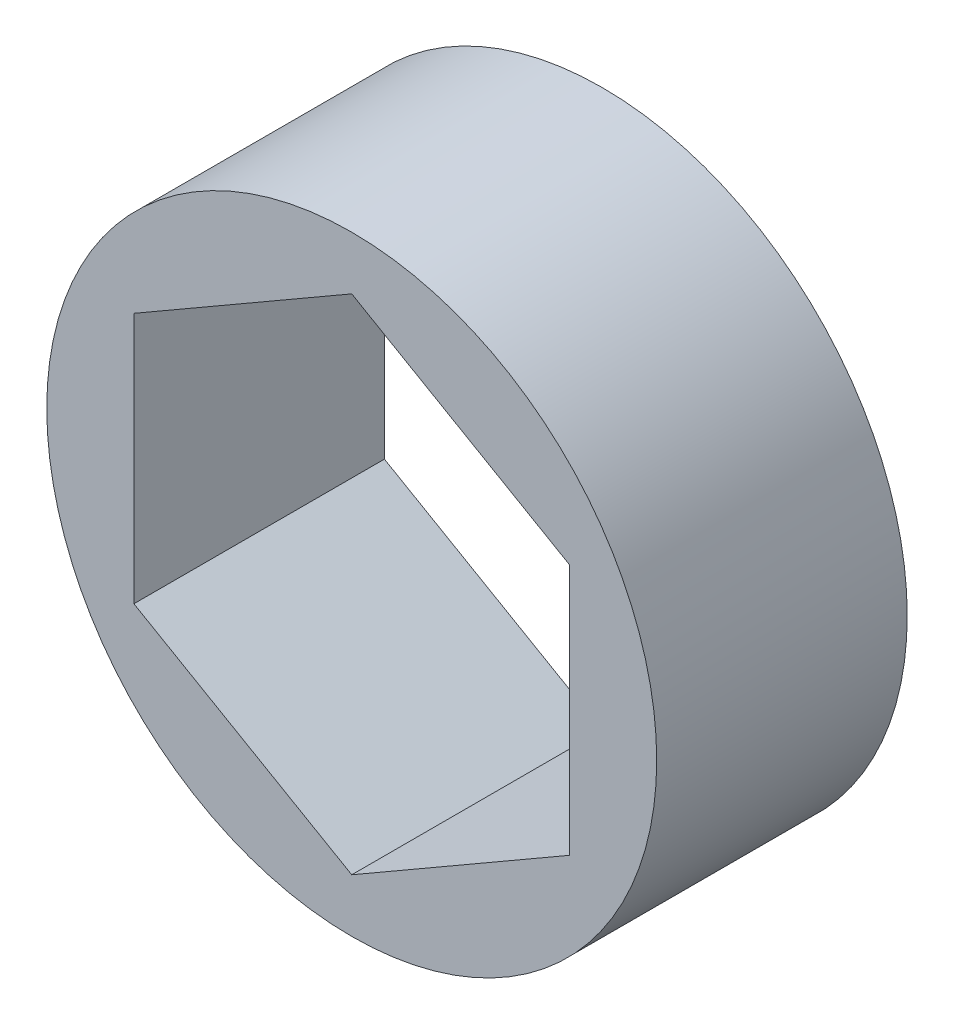
ISO-10303-21;
HEADER;
FILE_DESCRIPTION(('STEP AP214'),'2;1');
FILE_NAME('part.step','',(''),(''),'','','');
FILE_SCHEMA(('AUTOMOTIVE_DESIGN { 1 0 10303 214 1 1 1 1 }'));
ENDSEC;
DATA;
#1=APPLICATION_CONTEXT('core data for automotive mechanical design processes');
#2=APPLICATION_PROTOCOL_DEFINITION('international standard','automotive_design',2000,#1);
#3=PRODUCT_CONTEXT('',#1,'mechanical');
#4=PRODUCT('Part','Part','',(#3));
#5=PRODUCT_RELATED_PRODUCT_CATEGORY('part','',(#4));
#6=PRODUCT_DEFINITION_FORMATION('','',#4);
#7=PRODUCT_DEFINITION_CONTEXT('part definition',#1,'design');
#8=PRODUCT_DEFINITION('design','',#6,#7);
#9=PRODUCT_DEFINITION_SHAPE('','',#8);
#10=(LENGTH_UNIT() NAMED_UNIT(*) SI_UNIT(.MILLI.,.METRE.));
#11=(NAMED_UNIT(*) PLANE_ANGLE_UNIT() SI_UNIT($,.RADIAN.));
#12=(NAMED_UNIT(*) SI_UNIT($,.STERADIAN.) SOLID_ANGLE_UNIT());
#13=UNCERTAINTY_MEASURE_WITH_UNIT(LENGTH_MEASURE(1.E-05),#10,'distance_accuracy_value','');
#14=(GEOMETRIC_REPRESENTATION_CONTEXT(3) GLOBAL_UNCERTAINTY_ASSIGNED_CONTEXT((#13)) GLOBAL_UNIT_ASSIGNED_CONTEXT((#10,
#11,#12)) REPRESENTATION_CONTEXT('',''));
#15=CARTESIAN_POINT('',(0.,0.,0.));
#16=DIRECTION('',(0.,0.,1.));
#17=DIRECTION('',(1.,0.,0.));
#18=AXIS2_PLACEMENT_3D('',#15,#16,#17);
#19=CARTESIAN_POINT('',(0.,0.,3.65125));
#20=DIRECTION('',(0.,0.,1.));
#21=DIRECTION('',(1.,0.,0.));
#22=AXIS2_PLACEMENT_3D('',#19,#20,#21);
#23=PLANE('',#22);
#24=CARTESIAN_POINT('',(0.,0.,3.65125));
#25=DIRECTION('',(0.,0.,1.));
#26=DIRECTION('',(1.,0.,0.));
#27=AXIS2_PLACEMENT_3D('',#24,#25,#26);
#28=CIRCLE('',#27,8.89);
#29=CARTESIAN_POINT('',(-8.89,0.,3.65125));
#30=VERTEX_POINT('',#29);
#31=EDGE_CURVE('E11',#30,#30,#28,.T.);
#32=ORIENTED_EDGE('',*,*,#31,.T.);
#33=EDGE_LOOP('',(#32));
#34=FACE_BOUND('',#33,.T.);
#35=DIRECTION('',(-0.866025403784438,-0.500000000000001,0.));
#36=VECTOR('',#35,1.);
#37=CARTESIAN_POINT('',(0.,7.33234841870825,3.65125));
#38=LINE('',#37,#36);
#39=CARTESIAN_POINT('',(0.,7.33234841870825,3.65125));
#40=VERTEX_POINT('',#39);
#41=CARTESIAN_POINT('',(-6.35000000000001,3.66617420935411,3.65125));
#42=VERTEX_POINT('',#41);
#43=EDGE_CURVE('E108',#40,#42,#38,.T.);
#44=ORIENTED_EDGE('',*,*,#43,.F.);
#45=DIRECTION('',(-0.866025403784441,0.499999999999995,0.));
#46=VECTOR('',#45,1.);
#47=CARTESIAN_POINT('',(6.34999999999995,3.6661742093542,3.65125));
#48=LINE('',#47,#46);
#49=CARTESIAN_POINT('',(6.34999999999995,3.6661742093542,3.65125));
#50=VERTEX_POINT('',#49);
#51=EDGE_CURVE('E99',#50,#40,#48,.T.);
#52=ORIENTED_EDGE('',*,*,#51,.F.);
#53=DIRECTION('',(0.,1.,0.));
#54=VECTOR('',#53,1.);
#55=CARTESIAN_POINT('',(6.35000000000003,-3.66617420935406,3.65125));
#56=LINE('',#55,#54);
#57=CARTESIAN_POINT('',(6.35000000000003,-3.66617420935406,3.65125));
#58=VERTEX_POINT('',#57);
#59=EDGE_CURVE('E133',#58,#50,#56,.T.);
#60=ORIENTED_EDGE('',*,*,#59,.F.);
#61=DIRECTION('',(0.866025403784435,0.500000000000007,0.));
#62=VECTOR('',#61,1.);
#63=CARTESIAN_POINT('',(0.,-7.33234841870824,3.65125));
#64=LINE('',#63,#62);
#65=CARTESIAN_POINT('',(0.,-7.33234841870824,3.65125));
#66=VERTEX_POINT('',#65);
#67=EDGE_CURVE('E130',#66,#58,#64,.T.);
#68=ORIENTED_EDGE('',*,*,#67,.F.);
#69=DIRECTION('',(0.866025403784442,-0.499999999999995,0.));
#70=VECTOR('',#69,1.);
#71=CARTESIAN_POINT('',(-6.34999999999998,-3.66617420935415,3.65125));
#72=LINE('',#71,#70);
#73=CARTESIAN_POINT('',(-6.34999999999998,-3.66617420935415,3.65125));
#74=VERTEX_POINT('',#73);
#75=EDGE_CURVE('E125',#74,#66,#72,.T.);
#76=ORIENTED_EDGE('',*,*,#75,.F.);
#77=DIRECTION('',(0.,-1.,0.));
#78=VECTOR('',#77,1.);
#79=CARTESIAN_POINT('',(-6.35000000000001,3.66617420935411,3.65125));
#80=LINE('',#79,#78);
#81=EDGE_CURVE('E121',#42,#74,#80,.T.);
#82=ORIENTED_EDGE('',*,*,#81,.F.);
#83=EDGE_LOOP('',(#44,#52,#60,#68,#76,#82));
#84=FACE_BOUND('',#83,.T.);
#85=ADVANCED_FACE('F45',(#34,#84),#23,.T.);
#86=CARTESIAN_POINT('',(0.,0.,-3.65125));
#87=DIRECTION('',(0.,0.,1.));
#88=DIRECTION('',(1.,0.,0.));
#89=AXIS2_PLACEMENT_3D('',#86,#87,#88);
#90=PLANE('',#89);
#91=CARTESIAN_POINT('',(0.,0.,-3.65125));
#92=DIRECTION('',(0.,0.,1.));
#93=DIRECTION('',(1.,0.,0.));
#94=AXIS2_PLACEMENT_3D('',#91,#92,#93);
#95=CIRCLE('',#94,8.89);
#96=CARTESIAN_POINT('',(-8.89,0.,-3.65125));
#97=VERTEX_POINT('',#96);
#98=EDGE_CURVE('E49',#97,#97,#95,.T.);
#99=ORIENTED_EDGE('',*,*,#98,.F.);
#100=EDGE_LOOP('',(#99));
#101=FACE_BOUND('',#100,.T.);
#102=DIRECTION('',(-0.866025403784441,0.499999999999995,0.));
#103=VECTOR('',#102,1.);
#104=CARTESIAN_POINT('',(6.34999999999995,3.6661742093542,-3.65125));
#105=LINE('',#104,#103);
#106=CARTESIAN_POINT('',(6.34999999999996,3.6661742093542,-3.65125));
#107=VERTEX_POINT('',#106);
#108=CARTESIAN_POINT('',(0.,7.33234841870825,-3.65125));
#109=VERTEX_POINT('',#108);
#110=EDGE_CURVE('E69',#107,#109,#105,.T.);
#111=ORIENTED_EDGE('',*,*,#110,.T.);
#112=DIRECTION('',(-0.866025403784438,-0.500000000000001,0.));
#113=VECTOR('',#112,1.);
#114=CARTESIAN_POINT('',(0.,7.33234841870825,-3.65125));
#115=LINE('',#114,#113);
#116=CARTESIAN_POINT('',(-6.35000000000001,3.66617420935411,-3.65125));
#117=VERTEX_POINT('',#116);
#118=EDGE_CURVE('E115',#109,#117,#115,.T.);
#119=ORIENTED_EDGE('',*,*,#118,.T.);
#120=DIRECTION('',(0.,-1.,0.));
#121=VECTOR('',#120,1.);
#122=CARTESIAN_POINT('',(-6.35000000000001,3.66617420935411,-3.65125));
#123=LINE('',#122,#121);
#124=CARTESIAN_POINT('',(-6.34999999999998,-3.66617420935415,-3.65125));
#125=VERTEX_POINT('',#124);
#126=EDGE_CURVE('E140',#117,#125,#123,.T.);
#127=ORIENTED_EDGE('',*,*,#126,.T.);
#128=DIRECTION('',(0.866025403784442,-0.499999999999995,0.));
#129=VECTOR('',#128,1.);
#130=CARTESIAN_POINT('',(-6.34999999999998,-3.66617420935415,-3.65125));
#131=LINE('',#130,#129);
#132=CARTESIAN_POINT('',(0.,-7.33234841870824,-3.65125));
#133=VERTEX_POINT('',#132);
#134=EDGE_CURVE('E144',#125,#133,#131,.T.);
#135=ORIENTED_EDGE('',*,*,#134,.T.);
#136=DIRECTION('',(0.866025403784435,0.500000000000007,0.));
#137=VECTOR('',#136,1.);
#138=CARTESIAN_POINT('',(0.,-7.33234841870824,-3.65125));
#139=LINE('',#138,#137);
#140=CARTESIAN_POINT('',(6.35000000000003,-3.66617420935406,-3.65125));
#141=VERTEX_POINT('',#140);
#142=EDGE_CURVE('E148',#133,#141,#139,.T.);
#143=ORIENTED_EDGE('',*,*,#142,.T.);
#144=DIRECTION('',(0.,1.,0.));
#145=VECTOR('',#144,1.);
#146=CARTESIAN_POINT('',(6.35000000000003,-3.66617420935406,-3.65125));
#147=LINE('',#146,#145);
#148=EDGE_CURVE('E109',#141,#107,#147,.T.);
#149=ORIENTED_EDGE('',*,*,#148,.T.);
#150=EDGE_LOOP('',(#111,#119,#127,#135,#143,#149));
#151=FACE_BOUND('',#150,.T.);
#152=ADVANCED_FACE('F172',(#101,#151),#90,.F.);
#153=CARTESIAN_POINT('',(0.,0.,3.65125));
#154=DIRECTION('',(0.,0.,-1.));
#155=DIRECTION('',(-1.,0.,0.));
#156=AXIS2_PLACEMENT_3D('',#153,#154,#155);
#157=CYLINDRICAL_SURFACE('',#156,8.89);
#158=CARTESIAN_POINT('',(-8.89,0.,3.65125));
#159=CARTESIAN_POINT('',(-8.89,0.,3.57518229166667));
#160=CARTESIAN_POINT('',(-8.89,0.,3.49911458333333));
#161=CARTESIAN_POINT('',(-8.89,0.,3.34697916666667));
#162=CARTESIAN_POINT('',(-8.89,0.,3.27091145833333));
#163=CARTESIAN_POINT('',(-8.89,0.,3.11877604166667));
#164=CARTESIAN_POINT('',(-8.89,0.,3.04270833333333));
#165=CARTESIAN_POINT('',(-8.89,0.,2.89057291666667));
#166=CARTESIAN_POINT('',(-8.89,0.,2.81450520833333));
#167=CARTESIAN_POINT('',(-8.89,0.,2.66236979166667));
#168=CARTESIAN_POINT('',(-8.89,0.,2.58630208333333));
#169=CARTESIAN_POINT('',(-8.89,0.,2.43416666666667));
#170=CARTESIAN_POINT('',(-8.89,0.,2.35809895833333));
#171=CARTESIAN_POINT('',(-8.89,0.,2.20596354166667));
#172=CARTESIAN_POINT('',(-8.89,0.,2.12989583333333));
#173=CARTESIAN_POINT('',(-8.89,0.,1.97776041666667));
#174=CARTESIAN_POINT('',(-8.89,0.,1.90169270833333));
#175=CARTESIAN_POINT('',(-8.89,0.,1.74955729166667));
#176=CARTESIAN_POINT('',(-8.89,0.,1.67348958333333));
#177=CARTESIAN_POINT('',(-8.89,0.,1.52135416666667));
#178=CARTESIAN_POINT('',(-8.89,0.,1.44528645833333));
#179=CARTESIAN_POINT('',(-8.89,0.,1.29315104166667));
#180=CARTESIAN_POINT('',(-8.89,0.,1.21708333333333));
#181=CARTESIAN_POINT('',(-8.89,0.,1.06494791666667));
#182=CARTESIAN_POINT('',(-8.89,0.,0.988880208333333));
#183=CARTESIAN_POINT('',(-8.89,0.,0.836744791666666));
#184=CARTESIAN_POINT('',(-8.89,0.,0.760677083333333));
#185=CARTESIAN_POINT('',(-8.89,0.,0.608541666666666));
#186=CARTESIAN_POINT('',(-8.89,0.,0.532473958333333));
#187=CARTESIAN_POINT('',(-8.89,0.,0.380338541666666));
#188=CARTESIAN_POINT('',(-8.89,0.,0.304270833333333));
#189=CARTESIAN_POINT('',(-8.89,0.,0.152135416666666));
#190=CARTESIAN_POINT('',(-8.89,0.,0.0760677083333329));
#191=CARTESIAN_POINT('',(-8.89,0.,-0.0760677083333338));
#192=CARTESIAN_POINT('',(-8.89,0.,-0.152135416666667));
#193=CARTESIAN_POINT('',(-8.89,0.,-0.304270833333334));
#194=CARTESIAN_POINT('',(-8.89,0.,-0.380338541666667));
#195=CARTESIAN_POINT('',(-8.89,0.,-0.532473958333333));
#196=CARTESIAN_POINT('',(-8.89,0.,-0.608541666666666));
#197=CARTESIAN_POINT('',(-8.89,0.,-0.760677083333333));
#198=CARTESIAN_POINT('',(-8.89,0.,-0.836744791666666));
#199=CARTESIAN_POINT('',(-8.89,0.,-0.988880208333333));
#200=CARTESIAN_POINT('',(-8.89,0.,-1.06494791666667));
#201=CARTESIAN_POINT('',(-8.89,0.,-1.21708333333333));
#202=CARTESIAN_POINT('',(-8.89,0.,-1.29315104166667));
#203=CARTESIAN_POINT('',(-8.89,0.,-1.44528645833333));
#204=CARTESIAN_POINT('',(-8.89,0.,-1.52135416666667));
#205=CARTESIAN_POINT('',(-8.89,0.,-1.67348958333333));
#206=CARTESIAN_POINT('',(-8.89,0.,-1.74955729166667));
#207=CARTESIAN_POINT('',(-8.89,0.,-1.90169270833333));
#208=CARTESIAN_POINT('',(-8.89,0.,-1.97776041666667));
#209=CARTESIAN_POINT('',(-8.89,0.,-2.12989583333333));
#210=CARTESIAN_POINT('',(-8.89,0.,-2.20596354166667));
#211=CARTESIAN_POINT('',(-8.89,0.,-2.35809895833333));
#212=CARTESIAN_POINT('',(-8.89,0.,-2.43416666666667));
#213=CARTESIAN_POINT('',(-8.89,0.,-2.58630208333333));
#214=CARTESIAN_POINT('',(-8.89,0.,-2.66236979166667));
#215=CARTESIAN_POINT('',(-8.89,0.,-2.81450520833333));
#216=CARTESIAN_POINT('',(-8.89,0.,-2.89057291666667));
#217=CARTESIAN_POINT('',(-8.89,0.,-3.04270833333333));
#218=CARTESIAN_POINT('',(-8.89,0.,-3.11877604166667));
#219=CARTESIAN_POINT('',(-8.89,0.,-3.27091145833333));
#220=CARTESIAN_POINT('',(-8.89,0.,-3.34697916666667));
#221=CARTESIAN_POINT('',(-8.89,0.,-3.49911458333333));
#222=CARTESIAN_POINT('',(-8.89,0.,-3.57518229166667));
#223=CARTESIAN_POINT('',(-8.89,0.,-3.65125));
#224=B_SPLINE_CURVE_WITH_KNOTS('',3,(#158,#159,#160,#161,#162,#163,#164,#165,#166,#167,#168,
#169,#170,#171,#172,#173,#174,#175,#176,#177,#178,#179,#180,#181,#182,#183,#184,#185,#186,#187,
#188,#189,#190,#191,#192,#193,#194,#195,#196,#197,#198,#199,#200,#201,#202,#203,#204,#205,#206,
#207,#208,#209,#210,#211,#212,#213,#214,#215,#216,#217,#218,#219,#220,#221,#222,#223),
.UNSPECIFIED.,.F.,.F.,(4,2,2,2,2,2,2,2,2,2,2,2,2,2,2,2,2,2,2,2,2,2,2,2,2,2,2,2,2,2,2,2,4),(0.,
0.228203125,0.45640625,0.684609375,0.9128125,1.141015625,1.36921875,1.597421875,1.825625,
2.053828125,2.28203125,2.510234375,2.7384375,2.966640625,3.19484375,3.423046875,3.65125,
3.879453125,4.10765625,4.335859375,4.5640625,4.792265625,5.02046875,5.248671875,5.476875,
5.705078125,5.93328125,6.161484375,6.3896875,6.617890625,6.84609375,7.074296875,7.3025),.UNSPECIFIED.);
#225=EDGE_CURVE('BSEAM47',#30,#97,#224,.T.);
#226=ORIENTED_EDGE('',*,*,#31,.F.);
#227=ORIENTED_EDGE('',*,*,#98,.T.);
#228=ORIENTED_EDGE('',*,*,#225,.T.);
#229=ORIENTED_EDGE('',*,*,#225,.F.);
#230=EDGE_LOOP('',(#226,#228,#227,#229));
#231=FACE_BOUND('',#230,.T.);
#232=ADVANCED_FACE('F47',(#231),#157,.T.);
#233=CARTESIAN_POINT('',(6.34999999999995,3.6661742093542,3.65125));
#234=DIRECTION('',(-0.499999999999995,-0.866025403784441,0.));
#235=DIRECTION('',(0.866025403784441,-0.499999999999995,0.));
#236=AXIS2_PLACEMENT_3D('',#233,#234,#235);
#237=PLANE('',#236);
#238=ORIENTED_EDGE('',*,*,#110,.F.);
#239=DIRECTION('',(0.,0.,-1.));
#240=VECTOR('',#239,1.);
#241=CARTESIAN_POINT('',(6.34999999999995,3.6661742093542,3.65125));
#242=LINE('',#241,#240);
#243=EDGE_CURVE('E103',#50,#107,#242,.T.);
#244=ORIENTED_EDGE('',*,*,#243,.F.);
#245=ORIENTED_EDGE('',*,*,#51,.T.);
#246=DIRECTION('',(0.,0.,-1.));
#247=VECTOR('',#246,1.);
#248=CARTESIAN_POINT('',(0.,7.33234841870825,3.65125));
#249=LINE('',#248,#247);
#250=EDGE_CURVE('E102',#40,#109,#249,.T.);
#251=ORIENTED_EDGE('',*,*,#250,.T.);
#252=EDGE_LOOP('',(#238,#244,#245,#251));
#253=FACE_BOUND('',#252,.T.);
#254=ADVANCED_FACE('F101',(#253),#237,.T.);
#255=CARTESIAN_POINT('',(0.,7.33234841870825,3.65125));
#256=DIRECTION('',(0.500000000000001,-0.866025403784438,0.));
#257=DIRECTION('',(0.866025403784438,0.500000000000001,0.));
#258=AXIS2_PLACEMENT_3D('',#255,#256,#257);
#259=PLANE('',#258);
#260=ORIENTED_EDGE('',*,*,#118,.F.);
#261=ORIENTED_EDGE('',*,*,#250,.F.);
#262=ORIENTED_EDGE('',*,*,#43,.T.);
#263=DIRECTION('',(0.,0.,-1.));
#264=VECTOR('',#263,1.);
#265=CARTESIAN_POINT('',(-6.35000000000001,3.66617420935411,3.65125));
#266=LINE('',#265,#264);
#267=EDGE_CURVE('E117',#42,#117,#266,.T.);
#268=ORIENTED_EDGE('',*,*,#267,.T.);
#269=EDGE_LOOP('',(#260,#261,#262,#268));
#270=FACE_BOUND('',#269,.T.);
#271=ADVANCED_FACE('F112',(#270),#259,.T.);
#272=CARTESIAN_POINT('',(-6.35000000000001,3.66617420935411,3.65125));
#273=DIRECTION('',(1.,0.,0.));
#274=DIRECTION('',(0.,1.,0.));
#275=AXIS2_PLACEMENT_3D('',#272,#273,#274);
#276=PLANE('',#275);
#277=ORIENTED_EDGE('',*,*,#126,.F.);
#278=ORIENTED_EDGE('',*,*,#267,.F.);
#279=ORIENTED_EDGE('',*,*,#81,.T.);
#280=DIRECTION('',(0.,0.,-1.));
#281=VECTOR('',#280,1.);
#282=CARTESIAN_POINT('',(-6.34999999999998,-3.66617420935415,3.65125));
#283=LINE('',#282,#281);
#284=EDGE_CURVE('E162',#74,#125,#283,.T.);
#285=ORIENTED_EDGE('',*,*,#284,.T.);
#286=EDGE_LOOP('',(#277,#278,#279,#285));
#287=FACE_BOUND('',#286,.T.);
#288=ADVANCED_FACE('F168',(#287),#276,.T.);
#289=CARTESIAN_POINT('',(-6.34999999999998,-3.66617420935415,3.65125));
#290=DIRECTION('',(0.499999999999995,0.866025403784442,0.));
#291=DIRECTION('',(-0.866025403784442,0.499999999999995,0.));
#292=AXIS2_PLACEMENT_3D('',#289,#290,#291);
#293=PLANE('',#292);
#294=ORIENTED_EDGE('',*,*,#134,.F.);
#295=ORIENTED_EDGE('',*,*,#284,.F.);
#296=ORIENTED_EDGE('',*,*,#75,.T.);
#297=DIRECTION('',(0.,0.,-1.));
#298=VECTOR('',#297,1.);
#299=CARTESIAN_POINT('',(0.,-7.33234841870824,3.65125));
#300=LINE('',#299,#298);
#301=EDGE_CURVE('E159',#66,#133,#300,.T.);
#302=ORIENTED_EDGE('',*,*,#301,.T.);
#303=EDGE_LOOP('',(#294,#295,#296,#302));
#304=FACE_BOUND('',#303,.T.);
#305=ADVANCED_FACE('F180',(#304),#293,.T.);
#306=CARTESIAN_POINT('',(0.,-7.33234841870824,3.65125));
#307=DIRECTION('',(-0.500000000000007,0.866025403784434,0.));
#308=DIRECTION('',(-0.866025403784435,-0.500000000000007,0.));
#309=AXIS2_PLACEMENT_3D('',#306,#307,#308);
#310=PLANE('',#309);
#311=ORIENTED_EDGE('',*,*,#142,.F.);
#312=ORIENTED_EDGE('',*,*,#301,.F.);
#313=ORIENTED_EDGE('',*,*,#67,.T.);
#314=DIRECTION('',(0.,0.,-1.));
#315=VECTOR('',#314,1.);
#316=CARTESIAN_POINT('',(6.35000000000003,-3.66617420935406,3.65125));
#317=LINE('',#316,#315);
#318=EDGE_CURVE('E61',#58,#141,#317,.T.);
#319=ORIENTED_EDGE('',*,*,#318,.T.);
#320=EDGE_LOOP('',(#311,#312,#313,#319));
#321=FACE_BOUND('',#320,.T.);
#322=ADVANCED_FACE('F178',(#321),#310,.T.);
#323=CARTESIAN_POINT('',(6.35000000000003,-3.66617420935406,3.65125));
#324=DIRECTION('',(-1.,0.,0.));
#325=DIRECTION('',(0.,-1.,0.));
#326=AXIS2_PLACEMENT_3D('',#323,#324,#325);
#327=PLANE('',#326);
#328=ORIENTED_EDGE('',*,*,#148,.F.);
#329=ORIENTED_EDGE('',*,*,#318,.F.);
#330=ORIENTED_EDGE('',*,*,#59,.T.);
#331=ORIENTED_EDGE('',*,*,#243,.T.);
#332=EDGE_LOOP('',(#328,#329,#330,#331));
#333=FACE_BOUND('',#332,.T.);
#334=ADVANCED_FACE('F174',(#333),#327,.T.);
#335=CLOSED_SHELL('',(#85,#152,#232,#254,#271,#288,#305,#322,#334));
#336=MANIFOLD_SOLID_BREP('B2',#335);
#337=ADVANCED_BREP_SHAPE_REPRESENTATION('',(#18,#336),#14);
#338=SHAPE_DEFINITION_REPRESENTATION(#9,#337);
ENDSEC;
END-ISO-10303-21;
